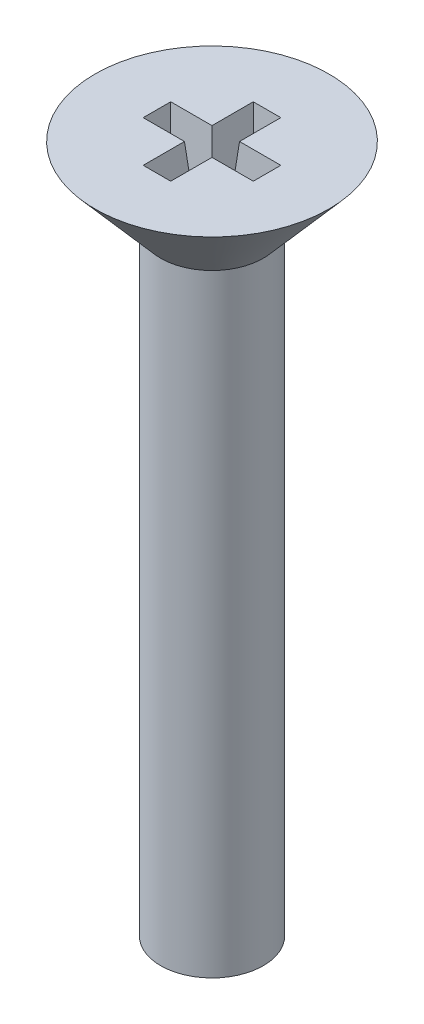
ISO-10303-21;
HEADER;
FILE_DESCRIPTION(('STEP AP214'),'2;1');
FILE_NAME('part.step','',(''),(''),'','','');
FILE_SCHEMA(('AUTOMOTIVE_DESIGN { 1 0 10303 214 1 1 1 1 }'));
ENDSEC;
DATA;
#1=APPLICATION_CONTEXT('core data for automotive mechanical design processes');
#2=APPLICATION_PROTOCOL_DEFINITION('international standard','automotive_design',2000,#1);
#3=PRODUCT_CONTEXT('',#1,'mechanical');
#4=PRODUCT('Part','Part','',(#3));
#5=PRODUCT_RELATED_PRODUCT_CATEGORY('part','',(#4));
#6=PRODUCT_DEFINITION_FORMATION('','',#4);
#7=PRODUCT_DEFINITION_CONTEXT('part definition',#1,'design');
#8=PRODUCT_DEFINITION('design','',#6,#7);
#9=PRODUCT_DEFINITION_SHAPE('','',#8);
#10=(LENGTH_UNIT() NAMED_UNIT(*) SI_UNIT(.MILLI.,.METRE.));
#11=(NAMED_UNIT(*) PLANE_ANGLE_UNIT() SI_UNIT($,.RADIAN.));
#12=(NAMED_UNIT(*) SI_UNIT($,.STERADIAN.) SOLID_ANGLE_UNIT());
#13=UNCERTAINTY_MEASURE_WITH_UNIT(LENGTH_MEASURE(1.E-05),#10,'distance_accuracy_value','');
#14=(GEOMETRIC_REPRESENTATION_CONTEXT(3) GLOBAL_UNCERTAINTY_ASSIGNED_CONTEXT((#13)) GLOBAL_UNIT_ASSIGNED_CONTEXT((#10,
#11,#12)) REPRESENTATION_CONTEXT('',''));
#15=CARTESIAN_POINT('',(0.,0.,0.));
#16=DIRECTION('',(0.,0.,1.));
#17=DIRECTION('',(1.,0.,0.));
#18=AXIS2_PLACEMENT_3D('',#15,#16,#17);
#19=CARTESIAN_POINT('',(0.,-16.9608159356459,0.));
#20=DIRECTION('',(0.,1.,0.));
#21=DIRECTION('',(-1.,0.,0.));
#22=AXIS2_PLACEMENT_3D('',#19,#20,#21);
#23=PLANE('',#22);
#24=CARTESIAN_POINT('',(0.,-16.9608159356459,0.));
#25=DIRECTION('',(0.,1.,0.));
#26=DIRECTION('',(-1.,0.,0.));
#27=AXIS2_PLACEMENT_3D('',#24,#25,#26);
#28=CIRCLE('',#27,1.4224);
#29=CARTESIAN_POINT('',(-1.4224,-16.9608159356459,0.));
#30=VERTEX_POINT('',#29);
#31=EDGE_CURVE('E11',#30,#30,#28,.T.);
#32=ORIENTED_EDGE('',*,*,#31,.F.);
#33=EDGE_LOOP('',(#32));
#34=FACE_BOUND('',#33,.T.);
#35=ADVANCED_FACE('F33',(#34),#23,.F.);
#36=CARTESIAN_POINT('',(0.,0.,0.));
#37=DIRECTION('',(0.,1.,0.));
#38=DIRECTION('',(-1.,0.,0.));
#39=AXIS2_PLACEMENT_3D('',#36,#37,#38);
#40=CYLINDRICAL_SURFACE('',#39,1.4224);
#41=CARTESIAN_POINT('',(0.,0.,0.));
#42=DIRECTION('',(0.,1.,0.));
#43=DIRECTION('',(-1.,0.,0.));
#44=AXIS2_PLACEMENT_3D('',#41,#42,#43);
#45=CIRCLE('',#44,1.4224);
#46=CARTESIAN_POINT('',(-1.4224,0.,0.));
#47=VERTEX_POINT('',#46);
#48=EDGE_CURVE('E40',#47,#47,#45,.T.);
#49=ORIENTED_EDGE('',*,*,#48,.F.);
#50=EDGE_LOOP('',(#49));
#51=FACE_BOUND('',#50,.T.);
#52=ORIENTED_EDGE('',*,*,#31,.T.);
#53=EDGE_LOOP('',(#52));
#54=FACE_BOUND('',#53,.T.);
#55=ADVANCED_FACE('F232',(#51,#54),#40,.T.);
#56=CARTESIAN_POINT('',(0.,0.,0.));
#57=DIRECTION('',(0.,1.,0.));
#58=DIRECTION('',(-1.,0.,0.));
#59=AXIS2_PLACEMENT_3D('',#56,#57,#58);
#60=CONICAL_SURFACE('',#59,1.4224,0.715584993317668);
#61=CARTESIAN_POINT('',(0.,2.0891840643541,0.));
#62=DIRECTION('',(0.,1.,0.));
#63=DIRECTION('',(-1.,0.,0.));
#64=AXIS2_PLACEMENT_3D('',#61,#62,#63);
#65=CIRCLE('',#64,3.23849999999999);
#66=CARTESIAN_POINT('',(-3.23849999999999,2.08918406435409,0.));
#67=VERTEX_POINT('',#66);
#68=EDGE_CURVE('E176',#67,#67,#65,.T.);
#69=ORIENTED_EDGE('',*,*,#68,.F.);
#70=EDGE_LOOP('',(#69));
#71=FACE_BOUND('',#70,.T.);
#72=ORIENTED_EDGE('',*,*,#48,.T.);
#73=EDGE_LOOP('',(#72));
#74=FACE_BOUND('',#73,.T.);
#75=ADVANCED_FACE('F230',(#71,#74),#60,.T.);
#76=CARTESIAN_POINT('',(3.23849999999999,2.0891840643541,0.));
#77=DIRECTION('',(0.,-1.,0.));
#78=DIRECTION('',(1.,0.,0.));
#79=AXIS2_PLACEMENT_3D('',#76,#77,#78);
#80=PLANE('',#79);
#81=DIRECTION('',(-1.,0.,0.));
#82=VECTOR('',#81,1.);
#83=CARTESIAN_POINT('',(-1.524,2.0891840643541,-0.381));
#84=LINE('',#83,#82);
#85=CARTESIAN_POINT('',(-0.381,2.0891840643541,-0.381));
#86=VERTEX_POINT('',#85);
#87=CARTESIAN_POINT('',(-1.524,2.0891840643541,-0.381));
#88=VERTEX_POINT('',#87);
#89=EDGE_CURVE('E139',#86,#88,#84,.T.);
#90=ORIENTED_EDGE('',*,*,#89,.F.);
#91=DIRECTION('',(0.,0.,1.));
#92=VECTOR('',#91,1.);
#93=CARTESIAN_POINT('',(-0.381,2.0891840643541,-0.381));
#94=LINE('',#93,#92);
#95=CARTESIAN_POINT('',(-0.381,2.0891840643541,-1.524));
#96=VERTEX_POINT('',#95);
#97=EDGE_CURVE('E47',#96,#86,#94,.T.);
#98=ORIENTED_EDGE('',*,*,#97,.F.);
#99=DIRECTION('',(-1.,0.,0.));
#100=VECTOR('',#99,1.);
#101=CARTESIAN_POINT('',(-0.381,2.0891840643541,-1.524));
#102=LINE('',#101,#100);
#103=CARTESIAN_POINT('',(0.381,2.0891840643541,-1.524));
#104=VERTEX_POINT('',#103);
#105=EDGE_CURVE('E172',#104,#96,#102,.T.);
#106=ORIENTED_EDGE('',*,*,#105,.F.);
#107=DIRECTION('',(0.,0.,-1.));
#108=VECTOR('',#107,1.);
#109=CARTESIAN_POINT('',(0.381,2.0891840643541,-1.524));
#110=LINE('',#109,#108);
#111=CARTESIAN_POINT('',(0.381,2.0891840643541,-0.381));
#112=VERTEX_POINT('',#111);
#113=EDGE_CURVE('E170',#112,#104,#110,.T.);
#114=ORIENTED_EDGE('',*,*,#113,.F.);
#115=DIRECTION('',(-1.,0.,0.));
#116=VECTOR('',#115,1.);
#117=CARTESIAN_POINT('',(0.381,2.0891840643541,-0.381));
#118=LINE('',#117,#116);
#119=CARTESIAN_POINT('',(1.524,2.0891840643541,-0.381));
#120=VERTEX_POINT('',#119);
#121=EDGE_CURVE('E167',#120,#112,#118,.T.);
#122=ORIENTED_EDGE('',*,*,#121,.F.);
#123=DIRECTION('',(0.,0.,-1.));
#124=VECTOR('',#123,1.);
#125=CARTESIAN_POINT('',(1.524,2.0891840643541,-0.381));
#126=LINE('',#125,#124);
#127=CARTESIAN_POINT('',(1.524,2.0891840643541,0.381));
#128=VERTEX_POINT('',#127);
#129=EDGE_CURVE('E164',#128,#120,#126,.T.);
#130=ORIENTED_EDGE('',*,*,#129,.F.);
#131=DIRECTION('',(1.,0.,0.));
#132=VECTOR('',#131,1.);
#133=CARTESIAN_POINT('',(1.524,2.0891840643541,0.381));
#134=LINE('',#133,#132);
#135=CARTESIAN_POINT('',(0.381,2.0891840643541,0.381));
#136=VERTEX_POINT('',#135);
#137=EDGE_CURVE('E161',#136,#128,#134,.T.);
#138=ORIENTED_EDGE('',*,*,#137,.F.);
#139=DIRECTION('',(0.,0.,-1.));
#140=VECTOR('',#139,1.);
#141=CARTESIAN_POINT('',(0.381,2.0891840643541,0.381));
#142=LINE('',#141,#140);
#143=CARTESIAN_POINT('',(0.381,2.0891840643541,1.524));
#144=VERTEX_POINT('',#143);
#145=EDGE_CURVE('E158',#144,#136,#142,.T.);
#146=ORIENTED_EDGE('',*,*,#145,.F.);
#147=DIRECTION('',(1.,0.,0.));
#148=VECTOR('',#147,1.);
#149=CARTESIAN_POINT('',(0.381,2.0891840643541,1.524));
#150=LINE('',#149,#148);
#151=CARTESIAN_POINT('',(-0.381,2.0891840643541,1.524));
#152=VERTEX_POINT('',#151);
#153=EDGE_CURVE('E155',#152,#144,#150,.T.);
#154=ORIENTED_EDGE('',*,*,#153,.F.);
#155=DIRECTION('',(0.,0.,1.));
#156=VECTOR('',#155,1.);
#157=CARTESIAN_POINT('',(-0.381,2.0891840643541,1.524));
#158=LINE('',#157,#156);
#159=CARTESIAN_POINT('',(-0.381,2.0891840643541,0.381));
#160=VERTEX_POINT('',#159);
#161=EDGE_CURVE('E149',#160,#152,#158,.T.);
#162=ORIENTED_EDGE('',*,*,#161,.F.);
#163=DIRECTION('',(1.,0.,0.));
#164=VECTOR('',#163,1.);
#165=CARTESIAN_POINT('',(-0.381,2.0891840643541,0.381));
#166=LINE('',#165,#164);
#167=CARTESIAN_POINT('',(-1.524,2.0891840643541,0.381));
#168=VERTEX_POINT('',#167);
#169=EDGE_CURVE('E147',#168,#160,#166,.T.);
#170=ORIENTED_EDGE('',*,*,#169,.F.);
#171=DIRECTION('',(0.,0.,1.));
#172=VECTOR('',#171,1.);
#173=CARTESIAN_POINT('',(-1.524,2.0891840643541,0.381));
#174=LINE('',#173,#172);
#175=EDGE_CURVE('E130',#88,#168,#174,.T.);
#176=ORIENTED_EDGE('',*,*,#175,.F.);
#177=EDGE_LOOP('',(#90,#98,#106,#114,#122,#130,#138,#146,#154,#162,#170,#176));
#178=FACE_BOUND('',#177,.T.);
#179=ORIENTED_EDGE('',*,*,#68,.T.);
#180=EDGE_LOOP('',(#179));
#181=FACE_BOUND('',#180,.T.);
#182=ADVANCED_FACE('F143',(#178,#181),#80,.F.);
#183=CARTESIAN_POINT('',(-0.381,2.0891840643541,-0.381));
#184=DIRECTION('',(-0.996194698091746,-0.0871557427476583,0.));
#185=DIRECTION('',(0.0871557427476583,-0.996194698091746,0.));
#186=AXIS2_PLACEMENT_3D('',#183,#184,#185);
#187=PLANE('',#186);
#188=ORIENTED_EDGE('',*,*,#97,.T.);
#189=DIRECTION('',(-0.0868265938642477,0.992432509138967,-0.0868265938642476));
#190=VECTOR('',#189,1.);
#191=CARTESIAN_POINT('',(-0.389616914010563,2.18767584218322,-0.389616914010563));
#192=LINE('',#191,#190);
#193=CARTESIAN_POINT('',(-0.19211197544753,-0.0698159356459045,-0.19211197544753));
#194=VERTEX_POINT('',#193);
#195=EDGE_CURVE('E90',#194,#86,#192,.T.);
#196=ORIENTED_EDGE('',*,*,#195,.F.);
#197=DIRECTION('',(0.,0.,1.));
#198=VECTOR('',#197,1.);
#199=CARTESIAN_POINT('',(-0.19211197544753,-0.0698159356459045,-0.381));
#200=LINE('',#199,#198);
#201=CARTESIAN_POINT('',(-0.19211197544753,-0.0698159356459045,-1.33511197544753));
#202=VERTEX_POINT('',#201);
#203=EDGE_CURVE('E174',#202,#194,#200,.T.);
#204=ORIENTED_EDGE('',*,*,#203,.F.);
#205=DIRECTION('',(-0.0868265938642477,0.992432509138967,-0.0868265938642476));
#206=VECTOR('',#205,1.);
#207=CARTESIAN_POINT('',(-0.381,2.0891840643541,-1.524));
#208=LINE('',#207,#206);
#209=EDGE_CURVE('E55',#202,#96,#208,.T.);
#210=ORIENTED_EDGE('',*,*,#209,.T.);
#211=EDGE_LOOP('',(#188,#196,#204,#210));
#212=FACE_BOUND('',#211,.T.);
#213=ADVANCED_FACE('F258',(#212),#187,.F.);
#214=CARTESIAN_POINT('',(-0.381,2.0891840643541,-1.524));
#215=DIRECTION('',(0.,-0.0871557427476582,-0.996194698091745));
#216=DIRECTION('',(0.,0.996194698091746,-0.0871557427476582));
#217=AXIS2_PLACEMENT_3D('',#214,#215,#216);
#218=PLANE('',#217);
#219=ORIENTED_EDGE('',*,*,#105,.T.);
#220=ORIENTED_EDGE('',*,*,#209,.F.);
#221=DIRECTION('',(-1.,0.,0.));
#222=VECTOR('',#221,1.);
#223=CARTESIAN_POINT('',(-0.381,-0.0698159356459045,-1.33511197544753));
#224=LINE('',#223,#222);
#225=CARTESIAN_POINT('',(0.19211197544753,-0.0698159356459045,-1.33511197544753));
#226=VERTEX_POINT('',#225);
#227=EDGE_CURVE('E177',#226,#202,#224,.T.);
#228=ORIENTED_EDGE('',*,*,#227,.F.);
#229=DIRECTION('',(0.0868265938642475,0.992432509138967,-0.0868265938642476));
#230=VECTOR('',#229,1.);
#231=CARTESIAN_POINT('',(0.381,2.0891840643541,-1.524));
#232=LINE('',#231,#230);
#233=EDGE_CURVE('E95',#226,#104,#232,.T.);
#234=ORIENTED_EDGE('',*,*,#233,.T.);
#235=EDGE_LOOP('',(#219,#220,#228,#234));
#236=FACE_BOUND('',#235,.T.);
#237=ADVANCED_FACE('F267',(#236),#218,.F.);
#238=CARTESIAN_POINT('',(0.381,2.0891840643541,-1.524));
#239=DIRECTION('',(0.996194698091746,-0.0871557427476581,0.));
#240=DIRECTION('',(0.0871557427476581,0.996194698091746,0.));
#241=AXIS2_PLACEMENT_3D('',#238,#239,#240);
#242=PLANE('',#241);
#243=ORIENTED_EDGE('',*,*,#113,.T.);
#244=ORIENTED_EDGE('',*,*,#233,.F.);
#245=DIRECTION('',(0.,0.,-1.));
#246=VECTOR('',#245,1.);
#247=CARTESIAN_POINT('',(0.19211197544753,-0.0698159356459045,-1.524));
#248=LINE('',#247,#246);
#249=CARTESIAN_POINT('',(0.19211197544753,-0.0698159356459045,-0.19211197544753));
#250=VERTEX_POINT('',#249);
#251=EDGE_CURVE('E200',#250,#226,#248,.T.);
#252=ORIENTED_EDGE('',*,*,#251,.F.);
#253=DIRECTION('',(0.0868265938642475,0.992432509138967,-0.0868265938642476));
#254=VECTOR('',#253,1.);
#255=CARTESIAN_POINT('',(0.389616914010563,2.18767584218322,-0.389616914010563));
#256=LINE('',#255,#254);
#257=EDGE_CURVE('E192',#250,#112,#256,.T.);
#258=ORIENTED_EDGE('',*,*,#257,.T.);
#259=EDGE_LOOP('',(#243,#244,#252,#258));
#260=FACE_BOUND('',#259,.T.);
#261=ADVANCED_FACE('F273',(#260),#242,.F.);
#262=CARTESIAN_POINT('',(0.381,2.0891840643541,-0.381));
#263=DIRECTION('',(0.,-0.0871557427476582,-0.996194698091746));
#264=DIRECTION('',(0.,0.996194698091746,-0.0871557427476582));
#265=AXIS2_PLACEMENT_3D('',#262,#263,#264);
#266=PLANE('',#265);
#267=ORIENTED_EDGE('',*,*,#121,.T.);
#268=ORIENTED_EDGE('',*,*,#257,.F.);
#269=DIRECTION('',(-1.,0.,0.));
#270=VECTOR('',#269,1.);
#271=CARTESIAN_POINT('',(0.381,-0.0698159356459045,-0.19211197544753));
#272=LINE('',#271,#270);
#273=CARTESIAN_POINT('',(1.33511197544753,-0.0698159356459045,-0.19211197544753));
#274=VERTEX_POINT('',#273);
#275=EDGE_CURVE('E203',#274,#250,#272,.T.);
#276=ORIENTED_EDGE('',*,*,#275,.F.);
#277=DIRECTION('',(0.0868265938642476,0.992432509138967,-0.0868265938642476));
#278=VECTOR('',#277,1.);
#279=CARTESIAN_POINT('',(1.524,2.0891840643541,-0.381));
#280=LINE('',#279,#278);
#281=EDGE_CURVE('E190',#274,#120,#280,.T.);
#282=ORIENTED_EDGE('',*,*,#281,.T.);
#283=EDGE_LOOP('',(#267,#268,#276,#282));
#284=FACE_BOUND('',#283,.T.);
#285=ADVANCED_FACE('F280',(#284),#266,.F.);
#286=CARTESIAN_POINT('',(1.524,2.0891840643541,-0.381));
#287=DIRECTION('',(0.996194698091745,-0.0871557427476581,0.));
#288=DIRECTION('',(0.0871557427476581,0.996194698091746,0.));
#289=AXIS2_PLACEMENT_3D('',#286,#287,#288);
#290=PLANE('',#289);
#291=ORIENTED_EDGE('',*,*,#129,.T.);
#292=ORIENTED_EDGE('',*,*,#281,.F.);
#293=DIRECTION('',(0.,0.,-1.));
#294=VECTOR('',#293,1.);
#295=CARTESIAN_POINT('',(1.33511197544753,-0.0698159356459045,-0.381));
#296=LINE('',#295,#294);
#297=CARTESIAN_POINT('',(1.33511197544753,-0.0698159356459045,0.19211197544753));
#298=VERTEX_POINT('',#297);
#299=EDGE_CURVE('E206',#298,#274,#296,.T.);
#300=ORIENTED_EDGE('',*,*,#299,.F.);
#301=DIRECTION('',(0.0868265938642476,0.992432509138967,0.0868265938642476));
#302=VECTOR('',#301,1.);
#303=CARTESIAN_POINT('',(1.524,2.0891840643541,0.381));
#304=LINE('',#303,#302);
#305=EDGE_CURVE('E188',#298,#128,#304,.T.);
#306=ORIENTED_EDGE('',*,*,#305,.T.);
#307=EDGE_LOOP('',(#291,#292,#300,#306));
#308=FACE_BOUND('',#307,.T.);
#309=ADVANCED_FACE('F288',(#308),#290,.F.);
#310=CARTESIAN_POINT('',(1.524,2.0891840643541,0.381));
#311=DIRECTION('',(0.,-0.0871557427476582,0.996194698091746));
#312=DIRECTION('',(0.,-0.996194698091746,-0.0871557427476582));
#313=AXIS2_PLACEMENT_3D('',#310,#311,#312);
#314=PLANE('',#313);
#315=ORIENTED_EDGE('',*,*,#137,.T.);
#316=ORIENTED_EDGE('',*,*,#305,.F.);
#317=DIRECTION('',(1.,0.,0.));
#318=VECTOR('',#317,1.);
#319=CARTESIAN_POINT('',(1.524,-0.0698159356459045,0.19211197544753));
#320=LINE('',#319,#318);
#321=CARTESIAN_POINT('',(0.19211197544753,-0.0698159356459045,0.19211197544753));
#322=VERTEX_POINT('',#321);
#323=EDGE_CURVE('E209',#322,#298,#320,.T.);
#324=ORIENTED_EDGE('',*,*,#323,.F.);
#325=DIRECTION('',(0.0868265938642475,0.992432509138967,0.0868265938642476));
#326=VECTOR('',#325,1.);
#327=CARTESIAN_POINT('',(0.389616914010563,2.18767584218322,0.389616914010563));
#328=LINE('',#327,#326);
#329=EDGE_CURVE('E186',#322,#136,#328,.T.);
#330=ORIENTED_EDGE('',*,*,#329,.T.);
#331=EDGE_LOOP('',(#315,#316,#324,#330));
#332=FACE_BOUND('',#331,.T.);
#333=ADVANCED_FACE('F296',(#332),#314,.F.);
#334=CARTESIAN_POINT('',(0.381,2.0891840643541,0.381));
#335=DIRECTION('',(0.996194698091746,-0.0871557427476581,0.));
#336=DIRECTION('',(0.0871557427476581,0.996194698091746,0.));
#337=AXIS2_PLACEMENT_3D('',#334,#335,#336);
#338=PLANE('',#337);
#339=ORIENTED_EDGE('',*,*,#145,.T.);
#340=ORIENTED_EDGE('',*,*,#329,.F.);
#341=DIRECTION('',(0.,0.,-1.));
#342=VECTOR('',#341,1.);
#343=CARTESIAN_POINT('',(0.19211197544753,-0.0698159356459045,0.381));
#344=LINE('',#343,#342);
#345=CARTESIAN_POINT('',(0.19211197544753,-0.0698159356459045,1.33511197544753));
#346=VERTEX_POINT('',#345);
#347=EDGE_CURVE('E212',#346,#322,#344,.T.);
#348=ORIENTED_EDGE('',*,*,#347,.F.);
#349=DIRECTION('',(0.0868265938642475,0.992432509138967,0.0868265938642476));
#350=VECTOR('',#349,1.);
#351=CARTESIAN_POINT('',(0.381,2.0891840643541,1.524));
#352=LINE('',#351,#350);
#353=EDGE_CURVE('E184',#346,#144,#352,.T.);
#354=ORIENTED_EDGE('',*,*,#353,.T.);
#355=EDGE_LOOP('',(#339,#340,#348,#354));
#356=FACE_BOUND('',#355,.T.);
#357=ADVANCED_FACE('F304',(#356),#338,.F.);
#358=CARTESIAN_POINT('',(0.381,2.0891840643541,1.524));
#359=DIRECTION('',(0.,-0.0871557427476582,0.996194698091745));
#360=DIRECTION('',(0.,-0.996194698091746,-0.0871557427476582));
#361=AXIS2_PLACEMENT_3D('',#358,#359,#360);
#362=PLANE('',#361);
#363=ORIENTED_EDGE('',*,*,#153,.T.);
#364=ORIENTED_EDGE('',*,*,#353,.F.);
#365=DIRECTION('',(1.,0.,0.));
#366=VECTOR('',#365,1.);
#367=CARTESIAN_POINT('',(0.381,-0.0698159356459045,1.33511197544753));
#368=LINE('',#367,#366);
#369=CARTESIAN_POINT('',(-0.19211197544753,-0.0698159356459045,1.33511197544753));
#370=VERTEX_POINT('',#369);
#371=EDGE_CURVE('E215',#370,#346,#368,.T.);
#372=ORIENTED_EDGE('',*,*,#371,.F.);
#373=DIRECTION('',(-0.0868265938642477,0.992432509138967,0.0868265938642476));
#374=VECTOR('',#373,1.);
#375=CARTESIAN_POINT('',(-0.381,2.0891840643541,1.524));
#376=LINE('',#375,#374);
#377=EDGE_CURVE('E182',#370,#152,#376,.T.);
#378=ORIENTED_EDGE('',*,*,#377,.T.);
#379=EDGE_LOOP('',(#363,#364,#372,#378));
#380=FACE_BOUND('',#379,.T.);
#381=ADVANCED_FACE('F312',(#380),#362,.F.);
#382=CARTESIAN_POINT('',(-0.381,2.0891840643541,1.524));
#383=DIRECTION('',(-0.996194698091746,-0.0871557427476583,0.));
#384=DIRECTION('',(0.0871557427476583,-0.996194698091746,0.));
#385=AXIS2_PLACEMENT_3D('',#382,#383,#384);
#386=PLANE('',#385);
#387=ORIENTED_EDGE('',*,*,#161,.T.);
#388=ORIENTED_EDGE('',*,*,#377,.F.);
#389=DIRECTION('',(0.,0.,1.));
#390=VECTOR('',#389,1.);
#391=CARTESIAN_POINT('',(-0.19211197544753,-0.0698159356459045,1.524));
#392=LINE('',#391,#390);
#393=CARTESIAN_POINT('',(-0.19211197544753,-0.0698159356459045,0.19211197544753));
#394=VERTEX_POINT('',#393);
#395=EDGE_CURVE('E218',#394,#370,#392,.T.);
#396=ORIENTED_EDGE('',*,*,#395,.F.);
#397=DIRECTION('',(-0.0868265938642477,0.992432509138967,0.0868265938642476));
#398=VECTOR('',#397,1.);
#399=CARTESIAN_POINT('',(-0.389616914010563,2.18767584218322,0.389616914010563));
#400=LINE('',#399,#398);
#401=EDGE_CURVE('E180',#394,#160,#400,.T.);
#402=ORIENTED_EDGE('',*,*,#401,.T.);
#403=EDGE_LOOP('',(#387,#388,#396,#402));
#404=FACE_BOUND('',#403,.T.);
#405=ADVANCED_FACE('F320',(#404),#386,.F.);
#406=CARTESIAN_POINT('',(-0.381,2.0891840643541,0.381));
#407=DIRECTION('',(0.,-0.0871557427476582,0.996194698091746));
#408=DIRECTION('',(0.,-0.996194698091746,-0.0871557427476582));
#409=AXIS2_PLACEMENT_3D('',#406,#407,#408);
#410=PLANE('',#409);
#411=ORIENTED_EDGE('',*,*,#169,.T.);
#412=ORIENTED_EDGE('',*,*,#401,.F.);
#413=DIRECTION('',(1.,0.,0.));
#414=VECTOR('',#413,1.);
#415=CARTESIAN_POINT('',(-0.381,-0.0698159356459045,0.19211197544753));
#416=LINE('',#415,#414);
#417=CARTESIAN_POINT('',(-1.33511197544753,-0.0698159356459045,0.19211197544753));
#418=VERTEX_POINT('',#417);
#419=EDGE_CURVE('E221',#418,#394,#416,.T.);
#420=ORIENTED_EDGE('',*,*,#419,.F.);
#421=DIRECTION('',(-0.0868265938642477,0.992432509138967,0.0868265938642476));
#422=VECTOR('',#421,1.);
#423=CARTESIAN_POINT('',(-1.524,2.0891840643541,0.381));
#424=LINE('',#423,#422);
#425=EDGE_CURVE('E136',#418,#168,#424,.T.);
#426=ORIENTED_EDGE('',*,*,#425,.T.);
#427=EDGE_LOOP('',(#411,#412,#420,#426));
#428=FACE_BOUND('',#427,.T.);
#429=ADVANCED_FACE('F328',(#428),#410,.F.);
#430=CARTESIAN_POINT('',(-1.524,2.0891840643541,0.381));
#431=DIRECTION('',(-0.996194698091745,-0.0871557427476583,0.));
#432=DIRECTION('',(0.0871557427476583,-0.996194698091746,0.));
#433=AXIS2_PLACEMENT_3D('',#430,#431,#432);
#434=PLANE('',#433);
#435=ORIENTED_EDGE('',*,*,#175,.T.);
#436=ORIENTED_EDGE('',*,*,#425,.F.);
#437=DIRECTION('',(0.,0.,1.));
#438=VECTOR('',#437,1.);
#439=CARTESIAN_POINT('',(-1.33511197544753,-0.0698159356459045,0.381));
#440=LINE('',#439,#438);
#441=CARTESIAN_POINT('',(-1.33511197544753,-0.0698159356459045,-0.19211197544753));
#442=VERTEX_POINT('',#441);
#443=EDGE_CURVE('E133',#442,#418,#440,.T.);
#444=ORIENTED_EDGE('',*,*,#443,.F.);
#445=DIRECTION('',(-0.0868265938642477,0.992432509138967,-0.0868265938642476));
#446=VECTOR('',#445,1.);
#447=CARTESIAN_POINT('',(-1.524,2.0891840643541,-0.381));
#448=LINE('',#447,#446);
#449=EDGE_CURVE('E126',#442,#88,#448,.T.);
#450=ORIENTED_EDGE('',*,*,#449,.T.);
#451=EDGE_LOOP('',(#435,#436,#444,#450));
#452=FACE_BOUND('',#451,.T.);
#453=ADVANCED_FACE('F128',(#452),#434,.F.);
#454=CARTESIAN_POINT('',(-1.524,2.0891840643541,-0.381));
#455=DIRECTION('',(0.,-0.0871557427476582,-0.996194698091746));
#456=DIRECTION('',(0.,0.996194698091746,-0.0871557427476582));
#457=AXIS2_PLACEMENT_3D('',#454,#455,#456);
#458=PLANE('',#457);
#459=ORIENTED_EDGE('',*,*,#89,.T.);
#460=ORIENTED_EDGE('',*,*,#449,.F.);
#461=DIRECTION('',(-1.,0.,0.));
#462=VECTOR('',#461,1.);
#463=CARTESIAN_POINT('',(-1.524,-0.0698159356459045,-0.19211197544753));
#464=LINE('',#463,#462);
#465=EDGE_CURVE('E197',#194,#442,#464,.T.);
#466=ORIENTED_EDGE('',*,*,#465,.F.);
#467=ORIENTED_EDGE('',*,*,#195,.T.);
#468=EDGE_LOOP('',(#459,#460,#466,#467));
#469=FACE_BOUND('',#468,.T.);
#470=ADVANCED_FACE('F140',(#469),#458,.F.);
#471=CARTESIAN_POINT('',(0.,-0.0698159356459045,0.));
#472=DIRECTION('',(0.,-1.,0.));
#473=DIRECTION('',(0.,0.,-1.));
#474=AXIS2_PLACEMENT_3D('',#471,#472,#473);
#475=PLANE('',#474);
#476=ORIENTED_EDGE('',*,*,#203,.T.);
#477=ORIENTED_EDGE('',*,*,#465,.T.);
#478=ORIENTED_EDGE('',*,*,#443,.T.);
#479=ORIENTED_EDGE('',*,*,#419,.T.);
#480=ORIENTED_EDGE('',*,*,#395,.T.);
#481=ORIENTED_EDGE('',*,*,#371,.T.);
#482=ORIENTED_EDGE('',*,*,#347,.T.);
#483=ORIENTED_EDGE('',*,*,#323,.T.);
#484=ORIENTED_EDGE('',*,*,#299,.T.);
#485=ORIENTED_EDGE('',*,*,#275,.T.);
#486=ORIENTED_EDGE('',*,*,#251,.T.);
#487=ORIENTED_EDGE('',*,*,#227,.T.);
#488=EDGE_LOOP('',(#476,#477,#478,#479,#480,#481,#482,#483,#484,#485,#486,#487));
#489=FACE_BOUND('',#488,.T.);
#490=ADVANCED_FACE('F349',(#489),#475,.F.);
#491=CLOSED_SHELL('',(#35,#55,#75,#182,#213,#237,#261,#285,#309,#333,#357,#381,#405,#429,#453,
#470,#490));
#492=MANIFOLD_SOLID_BREP('B2',#491);
#493=ADVANCED_BREP_SHAPE_REPRESENTATION('',(#18,#492),#14);
#494=SHAPE_DEFINITION_REPRESENTATION(#9,#493);
ENDSEC;
END-ISO-10303-21;
